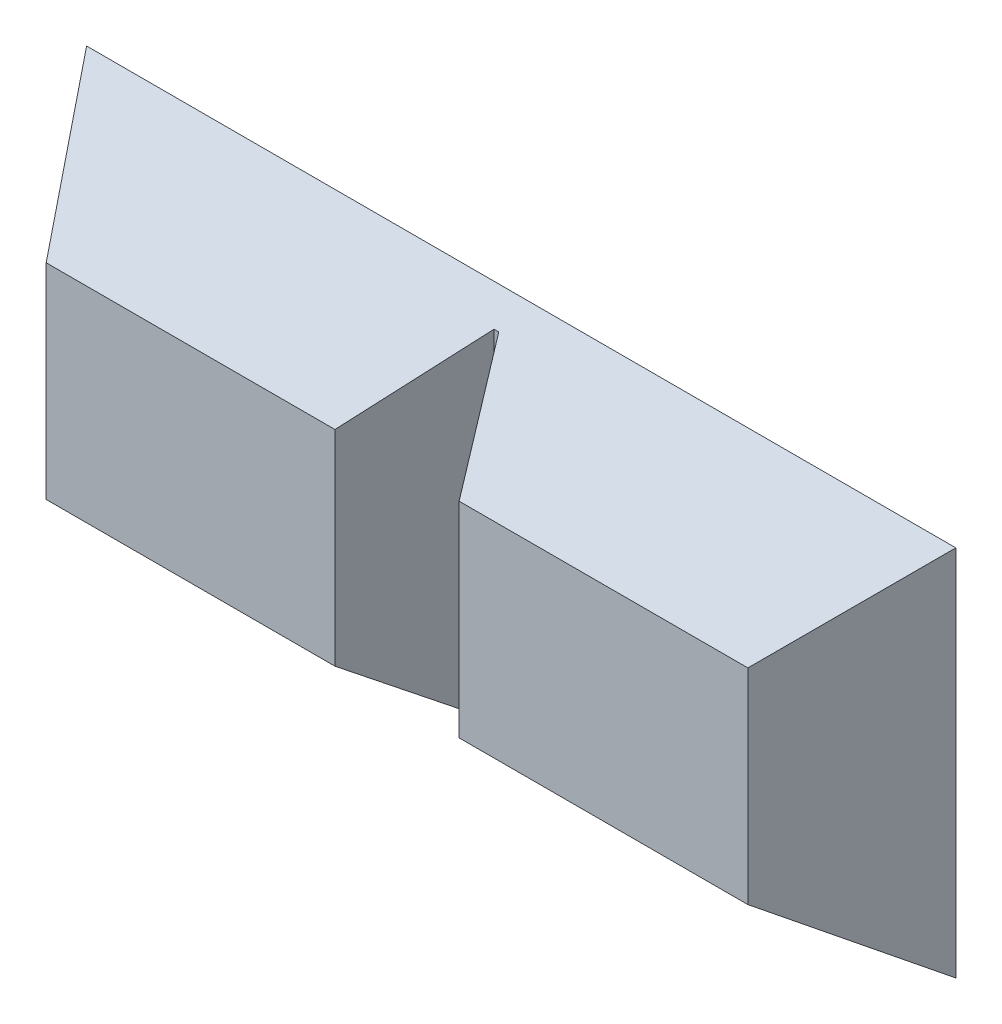
ISO-10303-21;
HEADER;
FILE_DESCRIPTION(('STEP AP214'),'2;1');
FILE_NAME('part.step','',(''),(''),'','','');
FILE_SCHEMA(('AUTOMOTIVE_DESIGN { 1 0 10303 214 1 1 1 1 }'));
ENDSEC;
DATA;
#1=APPLICATION_CONTEXT('core data for automotive mechanical design processes');
#2=APPLICATION_PROTOCOL_DEFINITION('international standard','automotive_design',2000,#1);
#3=PRODUCT_CONTEXT('',#1,'mechanical');
#4=PRODUCT('Part','Part','',(#3));
#5=PRODUCT_RELATED_PRODUCT_CATEGORY('part','',(#4));
#6=PRODUCT_DEFINITION_FORMATION('','',#4);
#7=PRODUCT_DEFINITION_CONTEXT('part definition',#1,'design');
#8=PRODUCT_DEFINITION('design','',#6,#7);
#9=PRODUCT_DEFINITION_SHAPE('','',#8);
#10=(LENGTH_UNIT() NAMED_UNIT(*) SI_UNIT(.MILLI.,.METRE.));
#11=(NAMED_UNIT(*) PLANE_ANGLE_UNIT() SI_UNIT($,.RADIAN.));
#12=(NAMED_UNIT(*) SI_UNIT($,.STERADIAN.) SOLID_ANGLE_UNIT());
#13=UNCERTAINTY_MEASURE_WITH_UNIT(LENGTH_MEASURE(1.E-05),#10,'distance_accuracy_value','');
#14=(GEOMETRIC_REPRESENTATION_CONTEXT(3) GLOBAL_UNCERTAINTY_ASSIGNED_CONTEXT((#13)) GLOBAL_UNIT_ASSIGNED_CONTEXT((#10,
#11,#12)) REPRESENTATION_CONTEXT('',''));
#15=CARTESIAN_POINT('',(0.,0.,0.));
#16=DIRECTION('',(0.,0.,1.));
#17=DIRECTION('',(1.,0.,0.));
#18=AXIS2_PLACEMENT_3D('',#15,#16,#17);
#19=CARTESIAN_POINT('',(-0.032826208725,0.191000078524,0.5));
#20=DIRECTION('',(0.,0.,1.));
#21=DIRECTION('',(1.,0.,0.));
#22=AXIS2_PLACEMENT_3D('',#19,#20,#21);
#23=PLANE('',#22);
#24=DIRECTION('',(0.,1.,0.));
#25=VECTOR('',#24,1.);
#26=CARTESIAN_POINT('',(9.917173791275,0.191000078524,0.5));
#27=LINE('',#26,#25);
#28=CARTESIAN_POINT('',(9.917173791275,-17.97174566305,0.5));
#29=VERTEX_POINT('',#28);
#30=CARTESIAN_POINT('',(9.917173791275,-17.14625417989,0.5));
#31=VERTEX_POINT('',#30);
#32=EDGE_CURVE('E133',#29,#31,#27,.T.);
#33=ORIENTED_EDGE('',*,*,#32,.F.);
#34=DIRECTION('',(-1.,0.,0.));
#35=VECTOR('',#34,1.);
#36=CARTESIAN_POINT('',(7.917173791275,-17.97174566305,0.5));
#37=LINE('',#36,#35);
#38=CARTESIAN_POINT('',(11.079919532854,-17.97174566305,0.5));
#39=VERTEX_POINT('',#38);
#40=EDGE_CURVE('E128',#39,#29,#37,.T.);
#41=ORIENTED_EDGE('',*,*,#40,.F.);
#42=DIRECTION('',(0.,-1.,0.));
#43=VECTOR('',#42,1.);
#44=CARTESIAN_POINT('',(11.079919532854,-16.80899992147,0.5));
#45=LINE('',#44,#43);
#46=CARTESIAN_POINT('',(11.079919532854,-17.14625417989,0.5));
#47=VERTEX_POINT('',#46);
#48=EDGE_CURVE('E11',#47,#39,#45,.T.);
#49=ORIENTED_EDGE('',*,*,#48,.F.);
#50=DIRECTION('',(1.,0.,0.));
#51=VECTOR('',#50,1.);
#52=CARTESIAN_POINT('',(7.917173791275,-17.14625417989,0.5));
#53=LINE('',#52,#51);
#54=EDGE_CURVE('E184',#31,#47,#53,.T.);
#55=ORIENTED_EDGE('',*,*,#54,.F.);
#56=EDGE_LOOP('',(#33,#41,#49,#55));
#57=FACE_BOUND('',#56,.T.);
#58=ADVANCED_FACE('F17',(#57),#23,.T.);
#59=CARTESIAN_POINT('',(11.417173791275,-16.80899992147,0.));
#60=DIRECTION('',(0.829037572554911,0.,0.55919290347094));
#61=DIRECTION('',(0.,-1.,0.));
#62=AXIS2_PLACEMENT_3D('',#59,#60,#61);
#63=PLANE('',#62);
#64=DIRECTION('',(0.,1.,0.));
#65=VECTOR('',#64,1.);
#66=CARTESIAN_POINT('',(11.417173791275,-16.80899992147,0.));
#67=LINE('',#66,#65);
#68=CARTESIAN_POINT('',(11.417173791275,-18.30899992147,0.));
#69=VERTEX_POINT('',#68);
#70=CARTESIAN_POINT('',(11.417173791275,-16.80899992147,0.));
#71=VERTEX_POINT('',#70);
#72=EDGE_CURVE('E122',#69,#71,#67,.T.);
#73=ORIENTED_EDGE('',*,*,#72,.T.);
#74=DIRECTION('',(0.488067010791191,0.488067010791191,-0.723589100218283));
#75=VECTOR('',#74,1.);
#76=CARTESIAN_POINT('',(10.583440866695,-17.64273284605,1.236059892146));
#77=LINE('',#76,#75);
#78=EDGE_CURVE('E26',#47,#71,#77,.T.);
#79=ORIENTED_EDGE('',*,*,#78,.F.);
#80=ORIENTED_EDGE('',*,*,#48,.T.);
#81=DIRECTION('',(0.488067010791191,-0.488067010791191,-0.723589100218283));
#82=VECTOR('',#81,1.);
#83=CARTESIAN_POINT('',(11.059859680741,-17.95168581094,0.529739953777));
#84=LINE('',#83,#82);
#85=EDGE_CURVE('E178',#39,#69,#84,.T.);
#86=ORIENTED_EDGE('',*,*,#85,.T.);
#87=EDGE_LOOP('',(#73,#79,#80,#86));
#88=FACE_BOUND('',#87,.T.);
#89=ADVANCED_FACE('F286',(#88),#63,.T.);
#90=CARTESIAN_POINT('',(7.917173791275,-16.80899992147,0.));
#91=DIRECTION('',(0.,0.829037572554911,0.55919290347094));
#92=DIRECTION('',(1.,0.,0.));
#93=AXIS2_PLACEMENT_3D('',#90,#91,#92);
#94=PLANE('',#93);
#95=DIRECTION('',(1.,0.,0.));
#96=VECTOR('',#95,1.);
#97=CARTESIAN_POINT('',(7.917173791275,-16.87645077316,0.1));
#98=LINE('',#97,#96);
#99=CARTESIAN_POINT('',(9.657518038886,-16.87645077316,0.1));
#100=VERTEX_POINT('',#99);
#101=CARTESIAN_POINT('',(9.676829543664,-16.87645077316,0.1));
#102=VERTEX_POINT('',#101);
#103=EDGE_CURVE('E105',#100,#102,#98,.T.);
#104=ORIENTED_EDGE('',*,*,#103,.T.);
#105=DIRECTION('',(-0.445878354815004,0.500529970303005,-0.742066197543008));
#106=VECTOR('',#105,1.);
#107=CARTESIAN_POINT('',(9.278856268126,-16.42969764052,-0.562338757002));
#108=LINE('',#107,#106);
#109=EDGE_CURVE('E136',#31,#102,#108,.T.);
#110=ORIENTED_EDGE('',*,*,#109,.F.);
#111=ORIENTED_EDGE('',*,*,#54,.T.);
#112=ORIENTED_EDGE('',*,*,#78,.T.);
#113=DIRECTION('',(-1.,0.,0.));
#114=VECTOR('',#113,1.);
#115=CARTESIAN_POINT('',(7.917173791275,-16.80899992147,0.));
#116=LINE('',#115,#114);
#117=CARTESIAN_POINT('',(7.917173791275,-16.80899992147,0.));
#118=VERTEX_POINT('',#117);
#119=EDGE_CURVE('E171',#71,#118,#116,.T.);
#120=ORIENTED_EDGE('',*,*,#119,.T.);
#121=DIRECTION('',(-0.488067010791191,0.488067010791191,-0.723589100218283));
#122=VECTOR('',#121,1.);
#123=CARTESIAN_POINT('',(7.917173791275,-16.80899992147,0.));
#124=LINE('',#123,#122);
#125=CARTESIAN_POINT('',(8.254428049696,-17.14625417989,0.5));
#126=VERTEX_POINT('',#125);
#127=EDGE_CURVE('E181',#126,#118,#124,.T.);
#128=ORIENTED_EDGE('',*,*,#127,.F.);
#129=DIRECTION('',(1.,0.,0.));
#130=VECTOR('',#129,1.);
#131=CARTESIAN_POINT('',(7.917173791275,-17.14625417989,0.5));
#132=LINE('',#131,#130);
#133=CARTESIAN_POINT('',(9.417173791275,-17.14625417989,0.5));
#134=VERTEX_POINT('',#133);
#135=EDGE_CURVE('E165',#126,#134,#132,.T.);
#136=ORIENTED_EDGE('',*,*,#135,.T.);
#137=DIRECTION('',(-0.445878354815004,-0.500529970303005,0.742066197543008));
#138=VECTOR('',#137,1.);
#139=CARTESIAN_POINT('',(9.359665038901,-17.21081181945,0.595710636632));
#140=LINE('',#139,#138);
#141=EDGE_CURVE('E138',#100,#134,#140,.T.);
#142=ORIENTED_EDGE('',*,*,#141,.F.);
#143=EDGE_LOOP('',(#104,#110,#111,#112,#120,#128,#136,#142));
#144=FACE_BOUND('',#143,.T.);
#145=ADVANCED_FACE('F284',(#144),#94,.T.);
#146=CARTESIAN_POINT('',(7.917173791275,-16.80899992147,0.));
#147=DIRECTION('',(-0.829037572554911,0.,0.55919290347094));
#148=DIRECTION('',(0.,1.,0.));
#149=AXIS2_PLACEMENT_3D('',#146,#147,#148);
#150=PLANE('',#149);
#151=DIRECTION('',(0.,-1.,0.));
#152=VECTOR('',#151,1.);
#153=CARTESIAN_POINT('',(7.917173791275,-16.80899992147,0.));
#154=LINE('',#153,#152);
#155=CARTESIAN_POINT('',(7.917173791275,-18.30899992147,0.));
#156=VERTEX_POINT('',#155);
#157=EDGE_CURVE('E168',#118,#156,#154,.T.);
#158=ORIENTED_EDGE('',*,*,#157,.T.);
#159=DIRECTION('',(-0.488067010791191,-0.488067010791191,-0.723589100218283));
#160=VECTOR('',#159,1.);
#161=CARTESIAN_POINT('',(7.917173791275,-18.30899992147,0.));
#162=LINE('',#161,#160);
#163=CARTESIAN_POINT('',(8.254428049696,-17.97174566305,0.5));
#164=VERTEX_POINT('',#163);
#165=EDGE_CURVE('E66',#164,#156,#162,.T.);
#166=ORIENTED_EDGE('',*,*,#165,.F.);
#167=DIRECTION('',(0.,1.,0.));
#168=VECTOR('',#167,1.);
#169=CARTESIAN_POINT('',(8.254428049696,-16.80899992147,0.5));
#170=LINE('',#169,#168);
#171=EDGE_CURVE('E160',#164,#126,#170,.T.);
#172=ORIENTED_EDGE('',*,*,#171,.T.);
#173=ORIENTED_EDGE('',*,*,#127,.T.);
#174=EDGE_LOOP('',(#158,#166,#172,#173));
#175=FACE_BOUND('',#174,.T.);
#176=ADVANCED_FACE('F277',(#175),#150,.T.);
#177=CARTESIAN_POINT('',(7.917173791275,-18.30899992147,0.));
#178=DIRECTION('',(0.,-0.829037572554911,0.55919290347094));
#179=DIRECTION('',(-1.,0.,0.));
#180=AXIS2_PLACEMENT_3D('',#177,#178,#179);
#181=PLANE('',#180);
#182=ORIENTED_EDGE('',*,*,#40,.T.);
#183=DIRECTION('',(0.445878354815004,0.500529970303005,0.742066197543008));
#184=VECTOR('',#183,1.);
#185=CARTESIAN_POINT('',(9.278856268126,-18.68830220242,-0.562338757002));
#186=LINE('',#185,#184);
#187=CARTESIAN_POINT('',(9.676829543664,-18.24154906979,0.1));
#188=VERTEX_POINT('',#187);
#189=EDGE_CURVE('E125',#188,#29,#186,.T.);
#190=ORIENTED_EDGE('',*,*,#189,.F.);
#191=DIRECTION('',(-1.,0.,0.));
#192=VECTOR('',#191,1.);
#193=CARTESIAN_POINT('',(7.917173791275,-18.24154906979,0.1));
#194=LINE('',#193,#192);
#195=CARTESIAN_POINT('',(9.657518038886,-18.24154906979,0.1));
#196=VERTEX_POINT('',#195);
#197=EDGE_CURVE('E112',#188,#196,#194,.T.);
#198=ORIENTED_EDGE('',*,*,#197,.T.);
#199=DIRECTION('',(0.445878354815004,-0.500529970303005,-0.742066197543008));
#200=VECTOR('',#199,1.);
#201=CARTESIAN_POINT('',(9.359665038901,-17.90718802349,0.595710636632));
#202=LINE('',#201,#200);
#203=CARTESIAN_POINT('',(9.417173791275,-17.97174566305,0.5));
#204=VERTEX_POINT('',#203);
#205=EDGE_CURVE('E148',#204,#196,#202,.T.);
#206=ORIENTED_EDGE('',*,*,#205,.F.);
#207=DIRECTION('',(-1.,0.,0.));
#208=VECTOR('',#207,1.);
#209=CARTESIAN_POINT('',(7.917173791275,-17.97174566305,0.5));
#210=LINE('',#209,#208);
#211=EDGE_CURVE('E164',#204,#164,#210,.T.);
#212=ORIENTED_EDGE('',*,*,#211,.T.);
#213=ORIENTED_EDGE('',*,*,#165,.T.);
#214=DIRECTION('',(1.,0.,0.));
#215=VECTOR('',#214,1.);
#216=CARTESIAN_POINT('',(7.917173791275,-18.30899992147,0.));
#217=LINE('',#216,#215);
#218=EDGE_CURVE('E159',#156,#69,#217,.T.);
#219=ORIENTED_EDGE('',*,*,#218,.T.);
#220=ORIENTED_EDGE('',*,*,#85,.F.);
#221=EDGE_LOOP('',(#182,#190,#198,#206,#212,#213,#219,#220));
#222=FACE_BOUND('',#221,.T.);
#223=ADVANCED_FACE('F126',(#222),#181,.T.);
#224=CARTESIAN_POINT('',(-0.032826208725,0.191000078524,0.5));
#225=DIRECTION('',(0.,0.,1.));
#226=DIRECTION('',(1.,0.,0.));
#227=AXIS2_PLACEMENT_3D('',#224,#225,#226);
#228=PLANE('',#227);
#229=DIRECTION('',(0.,-1.,0.));
#230=VECTOR('',#229,1.);
#231=CARTESIAN_POINT('',(9.417173791275,0.191000078524,0.5));
#232=LINE('',#231,#230);
#233=EDGE_CURVE('E258',#134,#204,#232,.T.);
#234=ORIENTED_EDGE('',*,*,#233,.F.);
#235=ORIENTED_EDGE('',*,*,#135,.F.);
#236=ORIENTED_EDGE('',*,*,#171,.F.);
#237=ORIENTED_EDGE('',*,*,#211,.F.);
#238=EDGE_LOOP('',(#234,#235,#236,#237));
#239=FACE_BOUND('',#238,.T.);
#240=ADVANCED_FACE('F274',(#239),#228,.T.);
#241=CARTESIAN_POINT('',(-0.032826208725,0.191000078524,0.));
#242=DIRECTION('',(0.,0.,1.));
#243=DIRECTION('',(1.,0.,0.));
#244=AXIS2_PLACEMENT_3D('',#241,#242,#243);
#245=PLANE('',#244);
#246=ORIENTED_EDGE('',*,*,#72,.F.);
#247=ORIENTED_EDGE('',*,*,#218,.F.);
#248=ORIENTED_EDGE('',*,*,#157,.F.);
#249=ORIENTED_EDGE('',*,*,#119,.F.);
#250=EDGE_LOOP('',(#246,#247,#248,#249));
#251=FACE_BOUND('',#250,.T.);
#252=ADVANCED_FACE('F282',(#251),#245,.F.);
#253=CARTESIAN_POINT('',(-0.032826208725,0.191000078524,0.1));
#254=DIRECTION('',(0.,0.,1.));
#255=DIRECTION('',(1.,0.,0.));
#256=AXIS2_PLACEMENT_3D('',#253,#254,#255);
#257=PLANE('',#256);
#258=ORIENTED_EDGE('',*,*,#103,.F.);
#259=DIRECTION('',(0.,-1.,0.));
#260=VECTOR('',#259,1.);
#261=CARTESIAN_POINT('',(9.657518038886,0.191000078524,0.1));
#262=LINE('',#261,#260);
#263=EDGE_CURVE('E118',#100,#196,#262,.T.);
#264=ORIENTED_EDGE('',*,*,#263,.T.);
#265=ORIENTED_EDGE('',*,*,#197,.F.);
#266=DIRECTION('',(0.,1.,0.));
#267=VECTOR('',#266,1.);
#268=CARTESIAN_POINT('',(9.676829543664,0.191000078524,0.1));
#269=LINE('',#268,#267);
#270=EDGE_CURVE('E116',#188,#102,#269,.T.);
#271=ORIENTED_EDGE('',*,*,#270,.T.);
#272=EDGE_LOOP('',(#258,#264,#265,#271));
#273=FACE_BOUND('',#272,.T.);
#274=ADVANCED_FACE('F114',(#273),#257,.T.);
#275=CARTESIAN_POINT('',(9.917173791275,-8.058999921476,0.5));
#276=DIRECTION('',(0.857167300702106,0.,-0.515038074910064));
#277=DIRECTION('',(0.,-1.,0.));
#278=AXIS2_PLACEMENT_3D('',#275,#276,#277);
#279=PLANE('',#278);
#280=ORIENTED_EDGE('',*,*,#270,.F.);
#281=ORIENTED_EDGE('',*,*,#189,.T.);
#282=ORIENTED_EDGE('',*,*,#32,.T.);
#283=ORIENTED_EDGE('',*,*,#109,.T.);
#284=EDGE_LOOP('',(#280,#281,#282,#283));
#285=FACE_BOUND('',#284,.T.);
#286=ADVANCED_FACE('F135',(#285),#279,.F.);
#287=CARTESIAN_POINT('',(9.417173791275,-8.058999921476,0.5));
#288=DIRECTION('',(-0.857167300702106,0.,-0.515038074910064));
#289=DIRECTION('',(-0.515038074910064,0.,0.857167300702106));
#290=AXIS2_PLACEMENT_3D('',#287,#288,#289);
#291=PLANE('',#290);
#292=ORIENTED_EDGE('',*,*,#233,.T.);
#293=ORIENTED_EDGE('',*,*,#205,.T.);
#294=ORIENTED_EDGE('',*,*,#263,.F.);
#295=ORIENTED_EDGE('',*,*,#141,.T.);
#296=EDGE_LOOP('',(#292,#293,#294,#295));
#297=FACE_BOUND('',#296,.T.);
#298=ADVANCED_FACE('F271',(#297),#291,.F.);
#299=CLOSED_SHELL('',(#58,#89,#145,#176,#223,#240,#252,#274,#286,#298));
#300=MANIFOLD_SOLID_BREP('B1',#299);
#301=ADVANCED_BREP_SHAPE_REPRESENTATION('',(#18,#300),#14);
#302=SHAPE_DEFINITION_REPRESENTATION(#9,#301);
ENDSEC;
END-ISO-10303-21;
